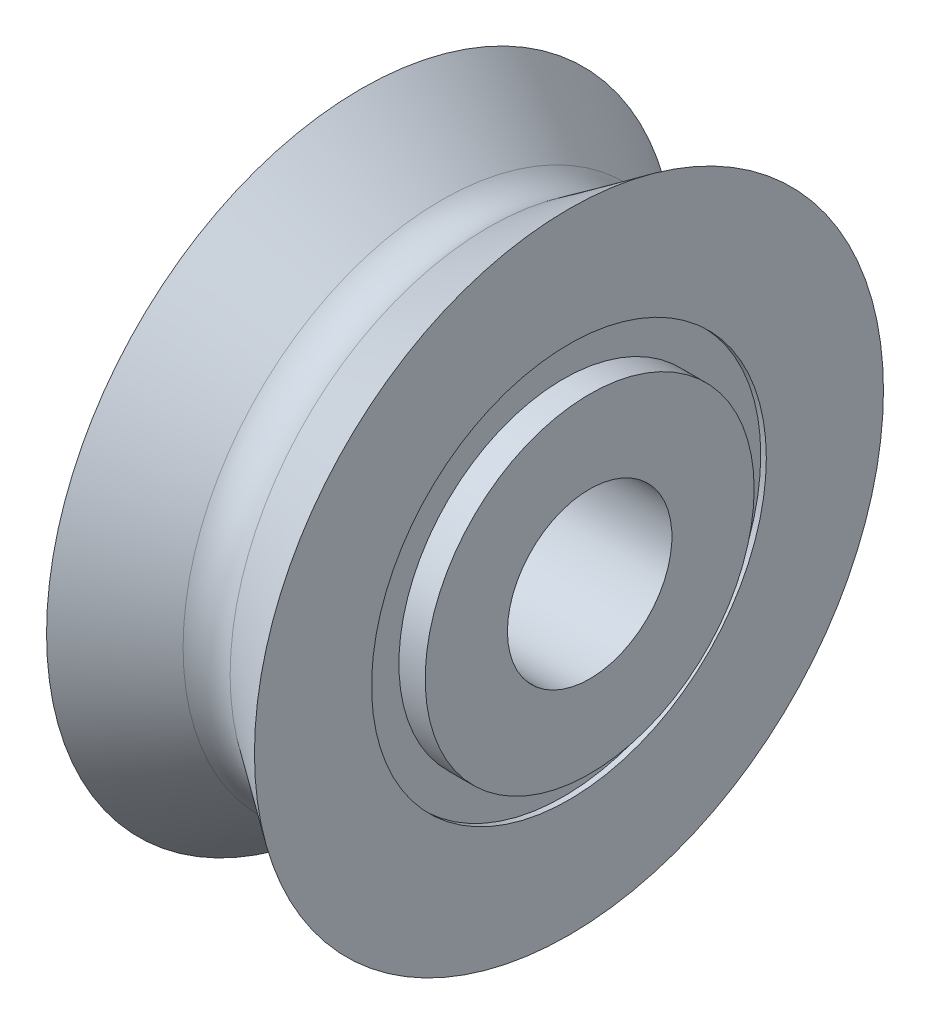
ISO-10303-21;
HEADER;
FILE_DESCRIPTION(('STEP AP214'),'2;1');
FILE_NAME('part.step','',(''),(''),'','','');
FILE_SCHEMA(('AUTOMOTIVE_DESIGN { 1 0 10303 214 1 1 1 1 }'));
ENDSEC;
DATA;
#1=APPLICATION_CONTEXT('core data for automotive mechanical design processes');
#2=APPLICATION_PROTOCOL_DEFINITION('international standard','automotive_design',2000,#1);
#3=PRODUCT_CONTEXT('',#1,'mechanical');
#4=PRODUCT('Part','Part','',(#3));
#5=PRODUCT_RELATED_PRODUCT_CATEGORY('part','',(#4));
#6=PRODUCT_DEFINITION_FORMATION('','',#4);
#7=PRODUCT_DEFINITION_CONTEXT('part definition',#1,'design');
#8=PRODUCT_DEFINITION('design','',#6,#7);
#9=PRODUCT_DEFINITION_SHAPE('','',#8);
#10=(LENGTH_UNIT() NAMED_UNIT(*) SI_UNIT(.MILLI.,.METRE.));
#11=(NAMED_UNIT(*) PLANE_ANGLE_UNIT() SI_UNIT($,.RADIAN.));
#12=(NAMED_UNIT(*) SI_UNIT($,.STERADIAN.) SOLID_ANGLE_UNIT());
#13=UNCERTAINTY_MEASURE_WITH_UNIT(LENGTH_MEASURE(1.E-05),#10,'distance_accuracy_value','');
#14=(GEOMETRIC_REPRESENTATION_CONTEXT(3) GLOBAL_UNCERTAINTY_ASSIGNED_CONTEXT((#13)) GLOBAL_UNIT_ASSIGNED_CONTEXT((#10,
#11,#12)) REPRESENTATION_CONTEXT('',''));
#15=CARTESIAN_POINT('',(0.,0.,0.));
#16=DIRECTION('',(0.,0.,1.));
#17=DIRECTION('',(1.,0.,0.));
#18=AXIS2_PLACEMENT_3D('',#15,#16,#17);
#19=CARTESIAN_POINT('',(1.95248538308538,0.,0.));
#20=DIRECTION('',(-1.,0.,0.));
#21=DIRECTION('',(0.,0.,1.));
#22=AXIS2_PLACEMENT_3D('',#19,#20,#21);
#23=CONICAL_SURFACE('',#22,4.98782107311927,0.609156514682367);
#24=CARTESIAN_POINT('',(1.95248538308538,0.,0.));
#25=DIRECTION('',(-1.,0.,0.));
#26=DIRECTION('',(0.,0.,1.));
#27=AXIS2_PLACEMENT_3D('',#24,#25,#26);
#28=CIRCLE('',#27,4.98782107311927);
#29=CARTESIAN_POINT('',(1.95248538308538,0.,4.98782107311927));
#30=VERTEX_POINT('',#29);
#31=EDGE_CURVE('E10',#30,#30,#28,.T.);
#32=ORIENTED_EDGE('',*,*,#31,.T.);
#33=EDGE_LOOP('',(#32));
#34=FACE_BOUND('',#33,.T.);
#35=CARTESIAN_POINT('',(0.40005,0.,0.));
#36=DIRECTION('',(-1.,0.,0.));
#37=DIRECTION('',(0.,0.,1.));
#38=AXIS2_PLACEMENT_3D('',#35,#36,#37);
#39=CIRCLE('',#38,6.07089948307961);
#40=CARTESIAN_POINT('',(0.40005,0.,6.07089948307961));
#41=VERTEX_POINT('',#40);
#42=EDGE_CURVE('E76',#41,#41,#39,.T.);
#43=ORIENTED_EDGE('',*,*,#42,.F.);
#44=EDGE_LOOP('',(#43));
#45=FACE_BOUND('',#44,.T.);
#46=ADVANCED_FACE('F32',(#34,#45),#23,.T.);
#47=CARTESIAN_POINT('',(0.508,0.,0.));
#48=DIRECTION('',(-1.,0.,0.));
#49=DIRECTION('',(0.,0.,1.));
#50=AXIS2_PLACEMENT_3D('',#47,#48,#49);
#51=CYLINDRICAL_SURFACE('',#50,3.81);
#52=CARTESIAN_POINT('',(0.508,0.,0.));
#53=DIRECTION('',(-1.,0.,0.));
#54=DIRECTION('',(0.,0.,1.));
#55=AXIS2_PLACEMENT_3D('',#52,#53,#54);
#56=CIRCLE('',#55,3.81);
#57=CARTESIAN_POINT('',(0.508,0.,3.81));
#58=VERTEX_POINT('',#57);
#59=EDGE_CURVE('E59',#58,#58,#56,.T.);
#60=ORIENTED_EDGE('',*,*,#59,.F.);
#61=EDGE_LOOP('',(#60));
#62=FACE_BOUND('',#61,.T.);
#63=CARTESIAN_POINT('',(0.40005,0.,0.));
#64=DIRECTION('',(-1.,0.,0.));
#65=DIRECTION('',(0.,0.,1.));
#66=AXIS2_PLACEMENT_3D('',#63,#64,#65);
#67=CIRCLE('',#66,3.81);
#68=CARTESIAN_POINT('',(0.40005,0.,3.81));
#69=VERTEX_POINT('',#68);
#70=EDGE_CURVE('E79',#69,#69,#67,.T.);
#71=ORIENTED_EDGE('',*,*,#70,.T.);
#72=EDGE_LOOP('',(#71));
#73=FACE_BOUND('',#72,.T.);
#74=ADVANCED_FACE('F83',(#62,#73),#51,.F.);
#75=CARTESIAN_POINT('',(4.8133,0.,0.));
#76=DIRECTION('',(1.,0.,0.));
#77=DIRECTION('',(0.,0.,-1.));
#78=AXIS2_PLACEMENT_3D('',#75,#76,#77);
#79=CONICAL_SURFACE('',#78,6.35,0.609156514682367);
#80=CARTESIAN_POINT('',(2.86081461691462,0.,0.));
#81=DIRECTION('',(-1.,0.,0.));
#82=DIRECTION('',(0.,0.,1.));
#83=AXIS2_PLACEMENT_3D('',#80,#81,#82);
#84=CIRCLE('',#83,4.98782107311927);
#85=CARTESIAN_POINT('',(2.86081461691462,0.,4.98782107311927));
#86=VERTEX_POINT('',#85);
#87=EDGE_CURVE('E39',#86,#86,#84,.T.);
#88=ORIENTED_EDGE('',*,*,#87,.F.);
#89=EDGE_LOOP('',(#88));
#90=FACE_BOUND('',#89,.T.);
#91=CARTESIAN_POINT('',(4.41325,0.,0.));
#92=DIRECTION('',(1.,0.,0.));
#93=DIRECTION('',(0.,0.,-1.));
#94=AXIS2_PLACEMENT_3D('',#91,#92,#93);
#95=CIRCLE('',#94,6.07089948307961);
#96=CARTESIAN_POINT('',(4.41325,0.,-6.07089948307961));
#97=VERTEX_POINT('',#96);
#98=EDGE_CURVE('E68',#97,#97,#95,.T.);
#99=ORIENTED_EDGE('',*,*,#98,.F.);
#100=EDGE_LOOP('',(#99));
#101=FACE_BOUND('',#100,.T.);
#102=ADVANCED_FACE('F96',(#90,#101),#79,.T.);
#103=CARTESIAN_POINT('',(4.3053,0.,0.));
#104=DIRECTION('',(1.,0.,0.));
#105=DIRECTION('',(0.,0.,-1.));
#106=AXIS2_PLACEMENT_3D('',#103,#104,#105);
#107=CYLINDRICAL_SURFACE('',#106,3.81);
#108=CARTESIAN_POINT('',(4.3053,0.,0.));
#109=DIRECTION('',(1.,0.,0.));
#110=DIRECTION('',(0.,0.,-1.));
#111=AXIS2_PLACEMENT_3D('',#108,#109,#110);
#112=CIRCLE('',#111,3.81);
#113=CARTESIAN_POINT('',(4.3053,0.,-3.81));
#114=VERTEX_POINT('',#113);
#115=EDGE_CURVE('E52',#114,#114,#112,.T.);
#116=ORIENTED_EDGE('',*,*,#115,.F.);
#117=EDGE_LOOP('',(#116));
#118=FACE_BOUND('',#117,.T.);
#119=CARTESIAN_POINT('',(4.41325,0.,0.));
#120=DIRECTION('',(1.,0.,0.));
#121=DIRECTION('',(0.,0.,-1.));
#122=AXIS2_PLACEMENT_3D('',#119,#120,#121);
#123=CIRCLE('',#122,3.81);
#124=CARTESIAN_POINT('',(4.41325,0.,-3.81));
#125=VERTEX_POINT('',#124);
#126=EDGE_CURVE('E73',#125,#125,#123,.T.);
#127=ORIENTED_EDGE('',*,*,#126,.T.);
#128=EDGE_LOOP('',(#127));
#129=FACE_BOUND('',#128,.T.);
#130=ADVANCED_FACE('F108',(#118,#129),#107,.F.);
#131=CARTESIAN_POINT('',(0.,6.35,0.));
#132=DIRECTION('',(1.,0.,0.));
#133=DIRECTION('',(0.,0.,-1.));
#134=AXIS2_PLACEMENT_3D('',#131,#132,#133);
#135=PLANE('',#134);
#136=CARTESIAN_POINT('',(0.,0.,0.));
#137=DIRECTION('',(-1.,0.,0.));
#138=DIRECTION('',(0.,0.,1.));
#139=AXIS2_PLACEMENT_3D('',#136,#137,#138);
#140=CIRCLE('',#139,1.5875);
#141=CARTESIAN_POINT('',(0.,0.,1.5875));
#142=VERTEX_POINT('',#141);
#143=EDGE_CURVE('E47',#142,#142,#140,.T.);
#144=ORIENTED_EDGE('',*,*,#143,.F.);
#145=EDGE_LOOP('',(#144));
#146=FACE_BOUND('',#145,.T.);
#147=CARTESIAN_POINT('',(0.,0.,0.));
#148=DIRECTION('',(-1.,0.,0.));
#149=DIRECTION('',(0.,0.,1.));
#150=AXIS2_PLACEMENT_3D('',#147,#148,#149);
#151=CIRCLE('',#150,3.175);
#152=CARTESIAN_POINT('',(0.,0.,3.175));
#153=VERTEX_POINT('',#152);
#154=EDGE_CURVE('E65',#153,#153,#151,.T.);
#155=ORIENTED_EDGE('',*,*,#154,.T.);
#156=EDGE_LOOP('',(#155));
#157=FACE_BOUND('',#156,.T.);
#158=ADVANCED_FACE('F34',(#146,#157),#135,.F.);
#159=CARTESIAN_POINT('',(4.8133,1.5875,0.));
#160=DIRECTION('',(-1.,0.,0.));
#161=DIRECTION('',(0.,0.,1.));
#162=AXIS2_PLACEMENT_3D('',#159,#160,#161);
#163=PLANE('',#162);
#164=CARTESIAN_POINT('',(4.8133,0.,0.));
#165=DIRECTION('',(-1.,0.,0.));
#166=DIRECTION('',(0.,0.,1.));
#167=AXIS2_PLACEMENT_3D('',#164,#165,#166);
#168=CIRCLE('',#167,1.5875);
#169=CARTESIAN_POINT('',(4.8133,0.,1.5875));
#170=VERTEX_POINT('',#169);
#171=EDGE_CURVE('E43',#170,#170,#168,.T.);
#172=ORIENTED_EDGE('',*,*,#171,.T.);
#173=EDGE_LOOP('',(#172));
#174=FACE_BOUND('',#173,.T.);
#175=CARTESIAN_POINT('',(4.8133,0.,0.));
#176=DIRECTION('',(1.,0.,0.));
#177=DIRECTION('',(0.,0.,-1.));
#178=AXIS2_PLACEMENT_3D('',#175,#176,#177);
#179=CIRCLE('',#178,3.175);
#180=CARTESIAN_POINT('',(4.8133,0.,-3.175));
#181=VERTEX_POINT('',#180);
#182=EDGE_CURVE('E56',#181,#181,#179,.T.);
#183=ORIENTED_EDGE('',*,*,#182,.T.);
#184=EDGE_LOOP('',(#183));
#185=FACE_BOUND('',#184,.T.);
#186=ADVANCED_FACE('F104',(#174,#185),#163,.F.);
#187=CARTESIAN_POINT('',(2.40665,0.,0.));
#188=DIRECTION('',(-1.,0.,0.));
#189=DIRECTION('',(0.,0.,1.));
#190=AXIS2_PLACEMENT_3D('',#187,#188,#189);
#191=TOROIDAL_SURFACE('',#190,5.6388,0.79375);
#192=ORIENTED_EDGE('',*,*,#31,.F.);
#193=EDGE_LOOP('',(#192));
#194=FACE_BOUND('',#193,.T.);
#195=ORIENTED_EDGE('',*,*,#87,.T.);
#196=EDGE_LOOP('',(#195));
#197=FACE_BOUND('',#196,.T.);
#198=ADVANCED_FACE('F100',(#194,#197),#191,.F.);
#199=CARTESIAN_POINT('',(0.,0.,0.));
#200=DIRECTION('',(-1.,0.,0.));
#201=DIRECTION('',(0.,0.,1.));
#202=AXIS2_PLACEMENT_3D('',#199,#200,#201);
#203=CYLINDRICAL_SURFACE('',#202,1.5875);
#204=ORIENTED_EDGE('',*,*,#171,.F.);
#205=EDGE_LOOP('',(#204));
#206=FACE_BOUND('',#205,.T.);
#207=ORIENTED_EDGE('',*,*,#143,.T.);
#208=EDGE_LOOP('',(#207));
#209=FACE_BOUND('',#208,.T.);
#210=ADVANCED_FACE('F103',(#206,#209),#203,.F.);
#211=CARTESIAN_POINT('',(4.3053,0.,0.));
#212=DIRECTION('',(1.,0.,0.));
#213=DIRECTION('',(0.,0.,-1.));
#214=AXIS2_PLACEMENT_3D('',#211,#212,#213);
#215=PLANE('',#214);
#216=CARTESIAN_POINT('',(4.3053,0.,0.));
#217=DIRECTION('',(1.,0.,0.));
#218=DIRECTION('',(0.,0.,-1.));
#219=AXIS2_PLACEMENT_3D('',#216,#217,#218);
#220=CIRCLE('',#219,3.175);
#221=CARTESIAN_POINT('',(4.3053,0.,-3.175));
#222=VERTEX_POINT('',#221);
#223=EDGE_CURVE('E55',#222,#222,#220,.T.);
#224=ORIENTED_EDGE('',*,*,#223,.F.);
#225=EDGE_LOOP('',(#224));
#226=FACE_BOUND('',#225,.T.);
#227=ORIENTED_EDGE('',*,*,#115,.T.);
#228=EDGE_LOOP('',(#227));
#229=FACE_BOUND('',#228,.T.);
#230=ADVANCED_FACE('F115',(#226,#229),#215,.T.);
#231=CARTESIAN_POINT('',(4.3053,0.,0.));
#232=DIRECTION('',(1.,0.,0.));
#233=DIRECTION('',(0.,0.,-1.));
#234=AXIS2_PLACEMENT_3D('',#231,#232,#233);
#235=CYLINDRICAL_SURFACE('',#234,3.175);
#236=ORIENTED_EDGE('',*,*,#223,.T.);
#237=EDGE_LOOP('',(#236));
#238=FACE_BOUND('',#237,.T.);
#239=ORIENTED_EDGE('',*,*,#182,.F.);
#240=EDGE_LOOP('',(#239));
#241=FACE_BOUND('',#240,.T.);
#242=ADVANCED_FACE('F122',(#238,#241),#235,.T.);
#243=CARTESIAN_POINT('',(0.508,0.,0.));
#244=DIRECTION('',(-1.,0.,0.));
#245=DIRECTION('',(0.,0.,1.));
#246=AXIS2_PLACEMENT_3D('',#243,#244,#245);
#247=PLANE('',#246);
#248=CARTESIAN_POINT('',(0.508,0.,0.));
#249=DIRECTION('',(-1.,0.,0.));
#250=DIRECTION('',(0.,0.,1.));
#251=AXIS2_PLACEMENT_3D('',#248,#249,#250);
#252=CIRCLE('',#251,3.175);
#253=CARTESIAN_POINT('',(0.508,0.,3.175));
#254=VERTEX_POINT('',#253);
#255=EDGE_CURVE('E64',#254,#254,#252,.T.);
#256=ORIENTED_EDGE('',*,*,#255,.F.);
#257=EDGE_LOOP('',(#256));
#258=FACE_BOUND('',#257,.T.);
#259=ORIENTED_EDGE('',*,*,#59,.T.);
#260=EDGE_LOOP('',(#259));
#261=FACE_BOUND('',#260,.T.);
#262=ADVANCED_FACE('F125',(#258,#261),#247,.T.);
#263=CARTESIAN_POINT('',(0.508,0.,0.));
#264=DIRECTION('',(-1.,0.,0.));
#265=DIRECTION('',(0.,0.,1.));
#266=AXIS2_PLACEMENT_3D('',#263,#264,#265);
#267=CYLINDRICAL_SURFACE('',#266,3.175);
#268=ORIENTED_EDGE('',*,*,#255,.T.);
#269=EDGE_LOOP('',(#268));
#270=FACE_BOUND('',#269,.T.);
#271=ORIENTED_EDGE('',*,*,#154,.F.);
#272=EDGE_LOOP('',(#271));
#273=FACE_BOUND('',#272,.T.);
#274=ADVANCED_FACE('F130',(#270,#273),#267,.T.);
#275=CARTESIAN_POINT('',(4.41325,0.,0.));
#276=DIRECTION('',(1.,0.,0.));
#277=DIRECTION('',(0.,0.,-1.));
#278=AXIS2_PLACEMENT_3D('',#275,#276,#277);
#279=PLANE('',#278);
#280=ORIENTED_EDGE('',*,*,#126,.F.);
#281=EDGE_LOOP('',(#280));
#282=FACE_BOUND('',#281,.T.);
#283=ORIENTED_EDGE('',*,*,#98,.T.);
#284=EDGE_LOOP('',(#283));
#285=FACE_BOUND('',#284,.T.);
#286=ADVANCED_FACE('F88',(#282,#285),#279,.T.);
#287=CARTESIAN_POINT('',(0.40005,0.,0.));
#288=DIRECTION('',(-1.,0.,0.));
#289=DIRECTION('',(0.,0.,1.));
#290=AXIS2_PLACEMENT_3D('',#287,#288,#289);
#291=PLANE('',#290);
#292=ORIENTED_EDGE('',*,*,#70,.F.);
#293=EDGE_LOOP('',(#292));
#294=FACE_BOUND('',#293,.T.);
#295=ORIENTED_EDGE('',*,*,#42,.T.);
#296=EDGE_LOOP('',(#295));
#297=FACE_BOUND('',#296,.T.);
#298=ADVANCED_FACE('F85',(#294,#297),#291,.T.);
#299=CLOSED_SHELL('',(#46,#74,#102,#130,#158,#186,#198,#210,#230,#242,#262,#274,#286,#298));
#300=MANIFOLD_SOLID_BREP('B2',#299);
#301=ADVANCED_BREP_SHAPE_REPRESENTATION('',(#18,#300),#14);
#302=SHAPE_DEFINITION_REPRESENTATION(#9,#301);
ENDSEC;
END-ISO-10303-21;
